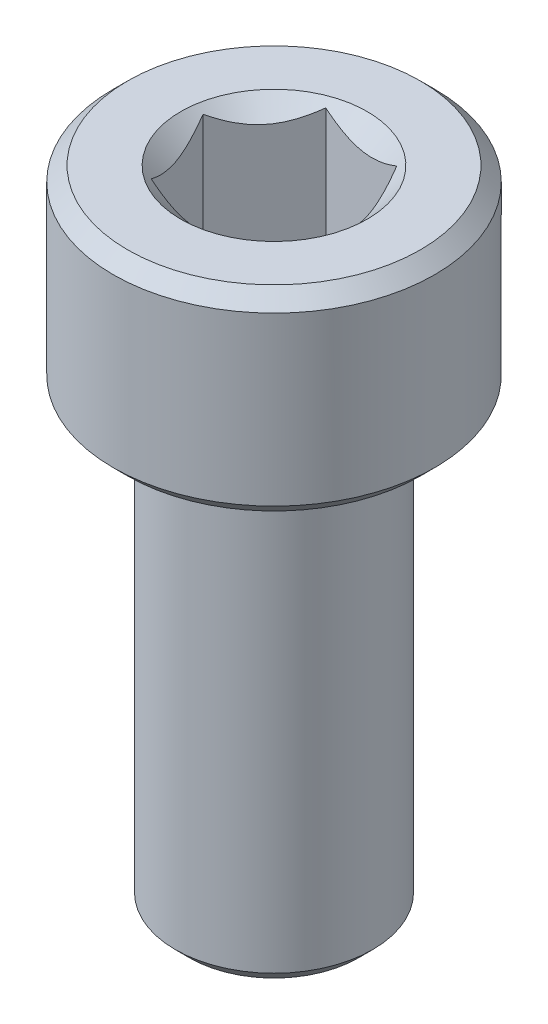
ISO-10303-21;
HEADER;
FILE_DESCRIPTION(('STEP AP214'),'2;1');
FILE_NAME('part.step','',(''),(''),'','','');
FILE_SCHEMA(('AUTOMOTIVE_DESIGN { 1 0 10303 214 1 1 1 1 }'));
ENDSEC;
DATA;
#1=APPLICATION_CONTEXT('core data for automotive mechanical design processes');
#2=APPLICATION_PROTOCOL_DEFINITION('international standard','automotive_design',2000,#1);
#3=PRODUCT_CONTEXT('',#1,'mechanical');
#4=PRODUCT('Part','Part','',(#3));
#5=PRODUCT_RELATED_PRODUCT_CATEGORY('part','',(#4));
#6=PRODUCT_DEFINITION_FORMATION('','',#4);
#7=PRODUCT_DEFINITION_CONTEXT('part definition',#1,'design');
#8=PRODUCT_DEFINITION('design','',#6,#7);
#9=PRODUCT_DEFINITION_SHAPE('','',#8);
#10=(LENGTH_UNIT() NAMED_UNIT(*) SI_UNIT(.MILLI.,.METRE.));
#11=(NAMED_UNIT(*) PLANE_ANGLE_UNIT() SI_UNIT($,.RADIAN.));
#12=(NAMED_UNIT(*) SI_UNIT($,.STERADIAN.) SOLID_ANGLE_UNIT());
#13=UNCERTAINTY_MEASURE_WITH_UNIT(LENGTH_MEASURE(1.E-05),#10,'distance_accuracy_value','');
#14=(GEOMETRIC_REPRESENTATION_CONTEXT(3) GLOBAL_UNCERTAINTY_ASSIGNED_CONTEXT((#13)) GLOBAL_UNIT_ASSIGNED_CONTEXT((#10,
#11,#12)) REPRESENTATION_CONTEXT('',''));
#15=CARTESIAN_POINT('',(0.,0.,0.));
#16=DIRECTION('',(0.,0.,1.));
#17=DIRECTION('',(1.,0.,0.));
#18=AXIS2_PLACEMENT_3D('',#15,#16,#17);
#19=CARTESIAN_POINT('',(-0.988367935483815,3.4671,1.18496081226657));
#20=DIRECTION('',(-0.170747114015538,0.,0.985314885229775));
#21=DIRECTION('',(0.985314885229775,0.,0.170747114015538));
#22=AXIS2_PLACEMENT_3D('',#19,#20,#21);
#23=PLANE('',#22);
#24=CARTESIAN_POINT('',(0.532022198169984,5.59435000000001,1.44843214654825));
#25=CARTESIAN_POINT('',(0.489893041082898,5.57299718910421,1.44113150378281));
#26=CARTESIAN_POINT('',(0.447260198669385,5.55267496213279,1.43374357641715));
#27=CARTESIAN_POINT('',(0.360727146416913,5.51464291974015,1.41874809714392));
#28=CARTESIAN_POINT('',(0.316823411230658,5.4969414150502,1.41113993432214));
#29=CARTESIAN_POINT('',(0.183722861510869,5.44897711903994,1.38807468373147));
#30=CARTESIAN_POINT('',(0.0926542408453633,5.42359455685349,1.3722932270732));
#31=CARTESIAN_POINT('',(-0.0652496055642205,5.39622882896523,1.3449297654321));
#32=CARTESIAN_POINT('',(-0.131285576429403,5.38954526130173,1.33348626486647));
#33=CARTESIAN_POINT('',(-0.263602647167514,5.38642346348592,1.3105567848574));
#34=CARTESIAN_POINT('',(-0.329883666691748,5.38998212918226,1.29907081933772));
#35=CARTESIAN_POINT('',(-0.44710441715348,5.4049627623266,1.27875740974236));
#36=CARTESIAN_POINT('',(-0.498290069621265,5.41453778015629,1.26988734945109));
#37=CARTESIAN_POINT('',(-0.599538914611206,5.43885629940858,1.2523417421142));
#38=CARTESIAN_POINT('',(-0.649599818871196,5.4536094725229,1.24366659160593));
#39=CARTESIAN_POINT('',(-0.748712926442786,5.48746849747554,1.22649109031934));
#40=CARTESIAN_POINT('',(-0.797752858505959,5.50661045824294,1.21799286604929));
#41=CARTESIAN_POINT('',(-0.894207955214743,5.54820948984585,1.201277976584));
#42=CARTESIAN_POINT('',(-0.941629227303755,5.57065187158946,1.19306025301814));
#43=CARTESIAN_POINT('',(-0.98836793548381,5.59435000000001,1.18496081226657));
#44=B_SPLINE_CURVE_WITH_KNOTS('',3,(#24,#25,#26,#27,#28,#29,#30,#31,#32,#33,#34,#35,#36,#37,#38,
#39,#40,#41,#42,#43),.UNSPECIFIED.,.F.,.F.,(4,2,2,2,2,2,2,2,2,4),(0.,0.143337612145358,
0.28712045853224,0.573034890803241,0.774383515114258,0.975671122383332,1.1338567978316,
1.292339516684,1.45217618135914,1.61132186571169),.UNSPECIFIED.);
#45=CARTESIAN_POINT('',(0.532022198169988,5.59435000000001,1.44843214654825));
#46=VERTEX_POINT('',#45);
#47=CARTESIAN_POINT('',(-0.988367935483813,5.59435000000002,1.18496081226657));
#48=VERTEX_POINT('',#47);
#49=EDGE_CURVE('E21',#46,#48,#44,.T.);
#50=ORIENTED_EDGE('',*,*,#49,.F.);
#51=DIRECTION('',(0.,1.,0.));
#52=VECTOR('',#51,1.);
#53=CARTESIAN_POINT('',(0.532022198169989,3.4671,1.44843214654825));
#54=LINE('',#53,#52);
#55=CARTESIAN_POINT('',(0.532022198169988,3.4671,1.44843214654825));
#56=VERTEX_POINT('',#55);
#57=EDGE_CURVE('E119',#46,#56,#54,.F.);
#58=ORIENTED_EDGE('',*,*,#57,.T.);
#59=DIRECTION('',(0.985314885229775,0.,0.170747114015538));
#60=VECTOR('',#59,1.);
#61=CARTESIAN_POINT('',(-0.988367935483815,3.4671,1.18496081226657));
#62=LINE('',#61,#60);
#63=CARTESIAN_POINT('',(-0.988367935483815,3.4671,1.18496081226657));
#64=VERTEX_POINT('',#63);
#65=EDGE_CURVE('E70',#64,#56,#62,.T.);
#66=ORIENTED_EDGE('',*,*,#65,.F.);
#67=DIRECTION('',(0.,1.,0.));
#68=VECTOR('',#67,1.);
#69=CARTESIAN_POINT('',(-0.988367935483815,3.4671,1.18496081226657));
#70=LINE('',#69,#68);
#71=EDGE_CURVE('E127',#64,#48,#70,.T.);
#72=ORIENTED_EDGE('',*,*,#71,.T.);
#73=EDGE_LOOP('',(#50,#58,#66,#72));
#74=FACE_BOUND('',#73,.T.);
#75=ADVANCED_FACE('F17',(#74),#23,.F.);
#76=CARTESIAN_POINT('',(-1.5203901336538,3.4671,-0.263471334281676));
#77=DIRECTION('',(-0.938681278343703,0.,0.344786104254553));
#78=DIRECTION('',(0.344786104254553,0.,0.938681278343703));
#79=AXIS2_PLACEMENT_3D('',#76,#77,#78);
#80=PLANE('',#79);
#81=CARTESIAN_POINT('',(-0.988367935483817,5.59435000000001,1.18496081226657));
#82=CARTESIAN_POINT('',(-1.00665379742504,5.5678577558261,1.13517749428827));
#83=CARTESIAN_POINT('',(-1.02524540062227,5.54292170500971,1.08456179475663));
#84=CARTESIAN_POINT('',(-1.06315558744464,5.49726486064311,0.981351189138943));
#85=CARTESIAN_POINT('',(-1.08247777436049,5.4765694622461,0.928746473082355));
#86=CARTESIAN_POINT('',(-1.12144001396706,5.441118100854,0.822671650374225));
#87=CARTESIAN_POINT('',(-1.14107014953794,5.426273056335,0.769228543113357));
#88=CARTESIAN_POINT('',(-1.18076246802838,5.4034014552768,0.661166078294517));
#89=CARTESIAN_POINT('',(-1.20082343925162,5.39535783229528,0.606550019583685));
#90=CARTESIAN_POINT('',(-1.23540034990448,5.38809997191749,0.512414269063899));
#91=CARTESIAN_POINT('',(-1.2498716667525,5.38702595601413,0.473016062376902));
#92=CARTESIAN_POINT('',(-1.27878882817659,5.38883833434812,0.39428899734533));
#93=CARTESIAN_POINT('',(-1.29323466642018,5.39172560342884,0.354960156240917));
#94=CARTESIAN_POINT('',(-1.32198687488843,5.4012936465334,0.276682176162418));
#95=CARTESIAN_POINT('',(-1.33629310282272,5.4079779480898,0.237733424574318));
#96=CARTESIAN_POINT('',(-1.3646666996486,5.42478005756205,0.160486215910536));
#97=CARTESIAN_POINT('',(-1.37873396332228,5.43489933878396,0.122188045290939));
#98=CARTESIAN_POINT('',(-1.4147460303796,5.46491755807321,0.0241450768416861));
#99=CARTESIAN_POINT('',(-1.43646421735889,5.48706949014084,-0.0349827570978526));
#100=CARTESIAN_POINT('',(-1.47905089985734,5.53696680038584,-0.150925137242471));
#101=CARTESIAN_POINT('',(-1.49992190217051,5.56469397054387,-0.207746508202284));
#102=CARTESIAN_POINT('',(-1.5203901336538,5.59435000000001,-0.263471334281672));
#103=B_SPLINE_CURVE_WITH_KNOTS('',3,(#81,#82,#83,#84,#85,#86,#87,#88,#89,#90,#91,#92,#93,#94,
#95,#96,#97,#98,#99,#100,#101,#102),.UNSPECIFIED.,.F.,.F.,(4,2,2,2,2,2,2,2,2,2,4),(0.,
0.177975101674256,0.356986718078619,0.533156235300421,0.708882376801158,0.83466105389366,
0.960467513475333,1.08639104181604,1.21236864873326,1.41234742485668,1.61168340439398),.UNSPECIFIED.);
#104=CARTESIAN_POINT('',(-1.5203901336538,5.59435000000002,-0.263471334281674));
#105=VERTEX_POINT('',#104);
#106=EDGE_CURVE('E129',#48,#105,#103,.T.);
#107=ORIENTED_EDGE('',*,*,#106,.F.);
#108=ORIENTED_EDGE('',*,*,#71,.F.);
#109=DIRECTION('',(0.344786104254553,0.,0.938681278343703));
#110=VECTOR('',#109,1.);
#111=CARTESIAN_POINT('',(-1.5203901336538,3.4671,-0.263471334281676));
#112=LINE('',#111,#110);
#113=CARTESIAN_POINT('',(-1.5203901336538,3.4671,-0.263471334281676));
#114=VERTEX_POINT('',#113);
#115=EDGE_CURVE('E116',#114,#64,#112,.T.);
#116=ORIENTED_EDGE('',*,*,#115,.F.);
#117=DIRECTION('',(0.,1.,0.));
#118=VECTOR('',#117,1.);
#119=CARTESIAN_POINT('',(-1.5203901336538,3.4671,-0.263471334281676));
#120=LINE('',#119,#118);
#121=EDGE_CURVE('E109',#114,#105,#120,.T.);
#122=ORIENTED_EDGE('',*,*,#121,.T.);
#123=EDGE_LOOP('',(#107,#108,#116,#122));
#124=FACE_BOUND('',#123,.T.);
#125=ADVANCED_FACE('F186',(#124),#80,.F.);
#126=CARTESIAN_POINT('',(0.532022198169989,3.4671,1.44843214654825));
#127=DIRECTION('',(0.767934164328165,0.,0.640528780975221));
#128=DIRECTION('',(0.640528780975221,0.,-0.767934164328165));
#129=AXIS2_PLACEMENT_3D('',#126,#127,#128);
#130=PLANE('',#129);
#131=CARTESIAN_POINT('',(1.5203901336538,5.59435000000001,0.26347133428168));
#132=CARTESIAN_POINT('',(1.48641944657053,5.5678577558261,0.304199014242022));
#133=CARTESIAN_POINT('',(1.45188076654442,5.54292170500971,0.345607664673719));
#134=CARTESIAN_POINT('',(1.38145285355071,5.49726486064311,0.430044152332958));
#135=CARTESIAN_POINT('',(1.34555692654477,5.4765694622461,0.473080015087051));
#136=CARTESIAN_POINT('',(1.27317455518088,5.441118100854,0.559859715728741));
#137=CARTESIAN_POINT('',(1.23670653442123,5.426273056335,0.603581465443289));
#138=CARTESIAN_POINT('',(1.16296785393777,5.4034014552768,0.691987254000534));
#139=CARTESIAN_POINT('',(1.12569944525123,5.39535783229528,0.736668594059863));
#140=CARTESIAN_POINT('',(1.06146394922321,5.38809997191749,0.813680952329511));
#141=CARTESIAN_POINT('',(1.03457975979273,5.38702595601414,0.845912583689617));
#142=CARTESIAN_POINT('',(0.980858702222046,5.38883833434813,0.910319112603995));
#143=CARTESIAN_POINT('',(0.954021845846016,5.39172560342884,0.942493996054109));
#144=CARTESIAN_POINT('',(0.900607230775229,5.4012936465334,1.00653312904177));
#145=CARTESIAN_POINT('',(0.874029736421392,5.4079779480898,1.03839706165925));
#146=CARTESIAN_POINT('',(0.821318489760058,5.42478005756205,1.10159292163909));
#147=CARTESIAN_POINT('',(0.795184932921856,5.43489933878396,1.13292461465203));
#148=CARTESIAN_POINT('',(0.72828326511103,5.46491755807321,1.21313346379108));
#149=CARTESIAN_POINT('',(0.687936152338284,5.48706949014084,1.26150588240906));
#150=CARTESIAN_POINT('',(0.608820447007038,5.53696680038584,1.35635822138793));
#151=CARTESIAN_POINT('',(0.570047197434563,5.56469397054387,1.40284372507348));
#152=CARTESIAN_POINT('',(0.532022198169992,5.59435000000001,1.44843214654825));
#153=B_SPLINE_CURVE_WITH_KNOTS('',3,(#131,#132,#133,#134,#135,#136,#137,#138,#139,#140,#141,
#142,#143,#144,#145,#146,#147,#148,#149,#150,#151,#152),.UNSPECIFIED.,.F.,.F.,(4,2,2,2,2,2,2,2,
2,2,4),(0.,0.177975101674256,0.356986718078619,0.533156235300421,0.708882376801158,
0.83466105389366,0.960467513475333,1.08639104181604,1.21236864873326,1.41234742485668,
1.61168340439398),.UNSPECIFIED.);
#154=CARTESIAN_POINT('',(1.5203901336538,5.59435000000001,0.263471334281676));
#155=VERTEX_POINT('',#154);
#156=EDGE_CURVE('E121',#155,#46,#153,.T.);
#157=ORIENTED_EDGE('',*,*,#156,.F.);
#158=DIRECTION('',(0.,1.,0.));
#159=VECTOR('',#158,1.);
#160=CARTESIAN_POINT('',(1.5203901336538,3.4671,0.263471334281676));
#161=LINE('',#160,#159);
#162=CARTESIAN_POINT('',(1.5203901336538,3.4671,0.263471334281676));
#163=VERTEX_POINT('',#162);
#164=EDGE_CURVE('E100',#155,#163,#161,.F.);
#165=ORIENTED_EDGE('',*,*,#164,.T.);
#166=DIRECTION('',(0.640528780975222,0.,-0.767934164328165));
#167=VECTOR('',#166,1.);
#168=CARTESIAN_POINT('',(0.532022198169988,3.4671,1.44843214654825));
#169=LINE('',#168,#167);
#170=EDGE_CURVE('E86',#56,#163,#169,.T.);
#171=ORIENTED_EDGE('',*,*,#170,.F.);
#172=ORIENTED_EDGE('',*,*,#57,.F.);
#173=EDGE_LOOP('',(#157,#165,#171,#172));
#174=FACE_BOUND('',#173,.T.);
#175=ADVANCED_FACE('F189',(#174),#130,.F.);
#176=CARTESIAN_POINT('',(2.50875806913762,3.4671,-0.921489477984898));
#177=DIRECTION('',(0.,1.,0.));
#178=DIRECTION('',(0.,0.,1.));
#179=AXIS2_PLACEMENT_3D('',#176,#177,#178);
#180=PLANE('',#179);
#181=ORIENTED_EDGE('',*,*,#115,.T.);
#182=ORIENTED_EDGE('',*,*,#65,.T.);
#183=ORIENTED_EDGE('',*,*,#170,.T.);
#184=DIRECTION('',(-0.344786104254553,0.,-0.938681278343703));
#185=VECTOR('',#184,1.);
#186=CARTESIAN_POINT('',(1.5203901336538,3.4671,0.263471334281676));
#187=LINE('',#186,#185);
#188=CARTESIAN_POINT('',(0.988367935483815,3.4671,-1.18496081226657));
#189=VERTEX_POINT('',#188);
#190=EDGE_CURVE('E79',#163,#189,#187,.T.);
#191=ORIENTED_EDGE('',*,*,#190,.T.);
#192=DIRECTION('',(-0.985314885229775,0.,-0.170747114015538));
#193=VECTOR('',#192,1.);
#194=CARTESIAN_POINT('',(0.988367935483815,3.4671,-1.18496081226657));
#195=LINE('',#194,#193);
#196=CARTESIAN_POINT('',(-0.532022198169989,3.4671,-1.44843214654825));
#197=VERTEX_POINT('',#196);
#198=EDGE_CURVE('E83',#189,#197,#195,.T.);
#199=ORIENTED_EDGE('',*,*,#198,.T.);
#200=DIRECTION('',(-0.640528780975221,0.,0.767934164328165));
#201=VECTOR('',#200,1.);
#202=CARTESIAN_POINT('',(-0.532022198169989,3.4671,-1.44843214654825));
#203=LINE('',#202,#201);
#204=EDGE_CURVE('E112',#197,#114,#203,.T.);
#205=ORIENTED_EDGE('',*,*,#204,.T.);
#206=EDGE_LOOP('',(#181,#182,#183,#191,#199,#205));
#207=FACE_BOUND('',#206,.T.);
#208=ADVANCED_FACE('F80',(#207),#180,.T.);
#209=CARTESIAN_POINT('',(-0.532022198169989,3.4671,-1.44843214654825));
#210=DIRECTION('',(-0.767934164328165,0.,-0.640528780975221));
#211=DIRECTION('',(-0.640528780975221,0.,0.767934164328165));
#212=AXIS2_PLACEMENT_3D('',#209,#210,#211);
#213=PLANE('',#212);
#214=CARTESIAN_POINT('',(-1.5203901336538,5.59435000000001,-0.26347133428168));
#215=CARTESIAN_POINT('',(-1.48641944657053,5.5678577558261,-0.304199014242022));
#216=CARTESIAN_POINT('',(-1.45188076654442,5.54292170500971,-0.345607664673719));
#217=CARTESIAN_POINT('',(-1.38145285355071,5.49726486064311,-0.430044152332958));
#218=CARTESIAN_POINT('',(-1.34555692654477,5.4765694622461,-0.473080015087051));
#219=CARTESIAN_POINT('',(-1.27317455518088,5.441118100854,-0.559859715728741));
#220=CARTESIAN_POINT('',(-1.23670653442123,5.426273056335,-0.603581465443289));
#221=CARTESIAN_POINT('',(-1.16296785393777,5.4034014552768,-0.691987254000534));
#222=CARTESIAN_POINT('',(-1.12569944525123,5.39535783229528,-0.736668594059863));
#223=CARTESIAN_POINT('',(-1.06146394922321,5.38809997191749,-0.813680952329511));
#224=CARTESIAN_POINT('',(-1.03457975979273,5.38702595601413,-0.845912583689617));
#225=CARTESIAN_POINT('',(-0.980858702222046,5.38883833434812,-0.910319112603995));
#226=CARTESIAN_POINT('',(-0.954021845846016,5.39172560342884,-0.942493996054109));
#227=CARTESIAN_POINT('',(-0.900607230775228,5.4012936465334,-1.00653312904177));
#228=CARTESIAN_POINT('',(-0.874029736421392,5.4079779480898,-1.03839706165925));
#229=CARTESIAN_POINT('',(-0.821318489760058,5.42478005756205,-1.10159292163909));
#230=CARTESIAN_POINT('',(-0.795184932921856,5.43489933878396,-1.13292461465203));
#231=CARTESIAN_POINT('',(-0.72828326511103,5.46491755807321,-1.21313346379108));
#232=CARTESIAN_POINT('',(-0.687936152338285,5.48706949014084,-1.26150588240906));
#233=CARTESIAN_POINT('',(-0.60882044700704,5.53696680038584,-1.35635822138792));
#234=CARTESIAN_POINT('',(-0.570047197434565,5.56469397054387,-1.40284372507348));
#235=CARTESIAN_POINT('',(-0.532022198169994,5.59435000000001,-1.44843214654824));
#236=B_SPLINE_CURVE_WITH_KNOTS('',3,(#214,#215,#216,#217,#218,#219,#220,#221,#222,#223,#224,
#225,#226,#227,#228,#229,#230,#231,#232,#233,#234,#235),.UNSPECIFIED.,.F.,.F.,(4,2,2,2,2,2,2,2,
2,2,4),(0.,0.177975101674255,0.356986718078619,0.533156235300421,0.708882376801157,
0.834661053893659,0.960467513475333,1.08639104181603,1.21236864873326,1.41234742485668,
1.61168340439398),.UNSPECIFIED.);
#237=CARTESIAN_POINT('',(-0.532022198169991,5.59435000000001,-1.44843214654825));
#238=VERTEX_POINT('',#237);
#239=EDGE_CURVE('E88',#105,#238,#236,.T.);
#240=ORIENTED_EDGE('',*,*,#239,.F.);
#241=ORIENTED_EDGE('',*,*,#121,.F.);
#242=ORIENTED_EDGE('',*,*,#204,.F.);
#243=DIRECTION('',(0.,1.,0.));
#244=VECTOR('',#243,1.);
#245=CARTESIAN_POINT('',(-0.532022198169989,3.4671,-1.44843214654825));
#246=LINE('',#245,#244);
#247=EDGE_CURVE('E95',#197,#238,#246,.T.);
#248=ORIENTED_EDGE('',*,*,#247,.T.);
#249=EDGE_LOOP('',(#240,#241,#242,#248));
#250=FACE_BOUND('',#249,.T.);
#251=ADVANCED_FACE('F196',(#250),#213,.F.);
#252=CARTESIAN_POINT('',(1.5203901336538,3.4671,0.263471334281676));
#253=DIRECTION('',(0.938681278343703,0.,-0.344786104254553));
#254=DIRECTION('',(-0.344786104254553,0.,-0.938681278343703));
#255=AXIS2_PLACEMENT_3D('',#252,#253,#254);
#256=PLANE('',#255);
#257=CARTESIAN_POINT('',(0.988367935483818,5.59435000000001,-1.18496081226657));
#258=CARTESIAN_POINT('',(1.00665379742504,5.5678577558261,-1.13517749428827));
#259=CARTESIAN_POINT('',(1.02524540062227,5.54292170500971,-1.08456179475663));
#260=CARTESIAN_POINT('',(1.06315558744464,5.49726486064311,-0.98135118913894));
#261=CARTESIAN_POINT('',(1.0824777743605,5.4765694622461,-0.928746473082352));
#262=CARTESIAN_POINT('',(1.12144001396707,5.441118100854,-0.822671650374223));
#263=CARTESIAN_POINT('',(1.14107014953794,5.426273056335,-0.769228543113355));
#264=CARTESIAN_POINT('',(1.18076246802839,5.4034014552768,-0.661166078294515));
#265=CARTESIAN_POINT('',(1.20082343925162,5.39535783229528,-0.606550019583684));
#266=CARTESIAN_POINT('',(1.23540034990448,5.38809997191749,-0.512414269063898));
#267=CARTESIAN_POINT('',(1.24987166675251,5.38702595601413,-0.4730160623769));
#268=CARTESIAN_POINT('',(1.27878882817659,5.38883833434812,-0.394288997345328));
#269=CARTESIAN_POINT('',(1.29323466642018,5.39172560342884,-0.354960156240915));
#270=CARTESIAN_POINT('',(1.32198687488843,5.4012936465334,-0.276682176162417));
#271=CARTESIAN_POINT('',(1.33629310282272,5.4079779480898,-0.237733424574317));
#272=CARTESIAN_POINT('',(1.3646666996486,5.42478005756205,-0.160486215910535));
#273=CARTESIAN_POINT('',(1.37873396332228,5.43489933878396,-0.122188045290938));
#274=CARTESIAN_POINT('',(1.4147460303796,5.46491755807321,-0.0241450768416855));
#275=CARTESIAN_POINT('',(1.43646421735889,5.48706949014084,0.0349827570978529));
#276=CARTESIAN_POINT('',(1.47905089985734,5.53696680038584,0.15092513724247));
#277=CARTESIAN_POINT('',(1.49992190217051,5.56469397054387,0.207746508202284));
#278=CARTESIAN_POINT('',(1.5203901336538,5.59435000000001,0.263471334281671));
#279=B_SPLINE_CURVE_WITH_KNOTS('',3,(#257,#258,#259,#260,#261,#262,#263,#264,#265,#266,#267,
#268,#269,#270,#271,#272,#273,#274,#275,#276,#277,#278),.UNSPECIFIED.,.F.,.F.,(4,2,2,2,2,2,2,2,
2,2,4),(0.,0.177975101674255,0.356986718078618,0.53315623530042,0.708882376801156,
0.834661053893658,0.960467513475331,1.08639104181603,1.21236864873326,1.41234742485668,
1.61168340439398),.UNSPECIFIED.);
#280=CARTESIAN_POINT('',(0.988367935483816,5.59435000000001,-1.18496081226657));
#281=VERTEX_POINT('',#280);
#282=EDGE_CURVE('E40',#281,#155,#279,.T.);
#283=ORIENTED_EDGE('',*,*,#282,.F.);
#284=DIRECTION('',(0.,1.,0.));
#285=VECTOR('',#284,1.);
#286=CARTESIAN_POINT('',(0.988367935483815,3.4671,-1.18496081226657));
#287=LINE('',#286,#285);
#288=EDGE_CURVE('E90',#281,#189,#287,.F.);
#289=ORIENTED_EDGE('',*,*,#288,.T.);
#290=ORIENTED_EDGE('',*,*,#190,.F.);
#291=ORIENTED_EDGE('',*,*,#164,.F.);
#292=EDGE_LOOP('',(#283,#289,#290,#291));
#293=FACE_BOUND('',#292,.T.);
#294=ADVANCED_FACE('F91',(#293),#256,.F.);
#295=CARTESIAN_POINT('',(0.988367935483815,3.4671,-1.18496081226657));
#296=DIRECTION('',(0.170747114015538,0.,-0.985314885229775));
#297=DIRECTION('',(-0.985314885229775,0.,-0.170747114015538));
#298=AXIS2_PLACEMENT_3D('',#295,#296,#297);
#299=PLANE('',#298);
#300=CARTESIAN_POINT('',(0.988367935483807,5.59435000000001,-1.18496081226658));
#301=CARTESIAN_POINT('',(0.936169586078008,5.56788797445681,-1.19400636476052));
#302=CARTESIAN_POINT('',(0.883100955821729,5.5429782824102,-1.20320272989907));
#303=CARTESIAN_POINT('',(0.774877004124437,5.49735734450454,-1.22195706691019));
#304=CARTESIAN_POINT('',(0.719710963595362,5.47667252654214,-1.23151689631417));
#305=CARTESIAN_POINT('',(0.608356482387243,5.44119434792655,-1.2508137288131));
#306=CARTESIAN_POINT('',(0.55219279065089,5.42632334461452,-1.26054644311611));
#307=CARTESIAN_POINT('',(0.438653596167497,5.40341436811877,-1.28022186878591));
#308=CARTESIAN_POINT('',(0.381281955390373,5.39535725276336,-1.2901639109045));
#309=CARTESIAN_POINT('',(0.269648056991862,5.38716732830295,-1.30950916414647));
#310=CARTESIAN_POINT('',(0.215420228150317,5.38656292716585,-1.31890640904028));
#311=CARTESIAN_POINT('',(0.107290135276257,5.39211715377099,-1.33764448107517));
#312=CARTESIAN_POINT('',(0.0533880792298612,5.39827972022178,-1.34698527217392));
#313=CARTESIAN_POINT('',(-0.0926411436653899,5.42360059140862,-1.37229095743766));
#314=CARTESIAN_POINT('',(-0.183734672962278,5.44898253675473,-1.38807673056064));
#315=CARTESIAN_POINT('',(-0.31684804153639,5.49694971502444,-1.41114420255525));
#316=CARTESIAN_POINT('',(-0.360749703630455,5.51465162458764,-1.4187520061269));
#317=CARTESIAN_POINT('',(-0.447272626262937,5.55268162132313,-1.43374573001877));
#318=CARTESIAN_POINT('',(-0.489897570611917,5.57300102438654,-1.44113228871362));
#319=CARTESIAN_POINT('',(-0.53202219816998,5.59435000000001,-1.44843214654825));
#320=B_SPLINE_CURVE_WITH_KNOTS('',3,(#300,#301,#302,#303,#304,#305,#306,#307,#308,#309,#310,
#311,#312,#313,#314,#315,#316,#317,#318,#319),.UNSPECIFIED.,.F.,.F.,(4,2,2,2,2,2,2,2,2,4),(0.,
0.177773553618219,0.356627201179562,0.533003262025737,0.708882170079772,0.873570161006529,
1.03835405929236,1.32429371127195,1.46807394211017,1.61138887760931),.UNSPECIFIED.);
#321=EDGE_CURVE('E94',#281,#238,#320,.T.);
#322=ORIENTED_EDGE('',*,*,#321,.T.);
#323=ORIENTED_EDGE('',*,*,#247,.F.);
#324=ORIENTED_EDGE('',*,*,#198,.F.);
#325=ORIENTED_EDGE('',*,*,#288,.F.);
#326=EDGE_LOOP('',(#322,#323,#324,#325));
#327=FACE_BOUND('',#326,.T.);
#328=ADVANCED_FACE('F98',(#327),#299,.F.);
#329=CARTESIAN_POINT('',(0.,5.70229999999994,0.));
#330=DIRECTION('',(0.,1.,0.));
#331=DIRECTION('',(0.,0.,1.));
#332=AXIS2_PLACEMENT_3D('',#329,#330,#331);
#333=CONICAL_SURFACE('',#332,1.65099999999996,0.785398163397622);
#334=ORIENTED_EDGE('',*,*,#156,.T.);
#335=ORIENTED_EDGE('',*,*,#49,.T.);
#336=ORIENTED_EDGE('',*,*,#106,.T.);
#337=ORIENTED_EDGE('',*,*,#239,.T.);
#338=ORIENTED_EDGE('',*,*,#321,.F.);
#339=ORIENTED_EDGE('',*,*,#282,.T.);
#340=EDGE_LOOP('',(#334,#335,#336,#337,#338,#339));
#341=FACE_BOUND('',#340,.T.);
#342=CARTESIAN_POINT('',(0.,5.70229999999994,0.));
#343=DIRECTION('',(0.,1.,0.));
#344=DIRECTION('',(0.,0.,1.));
#345=AXIS2_PLACEMENT_3D('',#342,#343,#344);
#346=CIRCLE('',#345,1.65099999999996);
#347=CARTESIAN_POINT('',(0.,5.70229999999994,1.65099999999996));
#348=VERTEX_POINT('',#347);
#349=EDGE_CURVE('E149',#348,#348,#346,.F.);
#350=ORIENTED_EDGE('',*,*,#349,.F.);
#351=EDGE_LOOP('',(#350));
#352=FACE_BOUND('',#351,.T.);
#353=ADVANCED_FACE('F163',(#341,#352),#333,.F.);
#354=CARTESIAN_POINT('',(0.,5.7023,2.8448));
#355=DIRECTION('',(0.,1.,0.));
#356=DIRECTION('',(0.,0.,1.));
#357=AXIS2_PLACEMENT_3D('',#354,#355,#356);
#358=PLANE('',#357);
#359=CARTESIAN_POINT('',(0.,5.70230000005267,0.));
#360=DIRECTION('',(0.,-1.,0.));
#361=DIRECTION('',(0.,0.,-1.));
#362=AXIS2_PLACEMENT_3D('',#359,#360,#361);
#363=CIRCLE('',#362,2.59079999995038);
#364=CARTESIAN_POINT('',(0.,5.70230000005267,-2.59079999995038));
#365=VERTEX_POINT('',#364);
#366=EDGE_CURVE('E145',#365,#365,#363,.T.);
#367=ORIENTED_EDGE('',*,*,#366,.F.);
#368=EDGE_LOOP('',(#367));
#369=FACE_BOUND('',#368,.T.);
#370=ORIENTED_EDGE('',*,*,#349,.T.);
#371=EDGE_LOOP('',(#370));
#372=FACE_BOUND('',#371,.T.);
#373=ADVANCED_FACE('F167',(#369,#372),#358,.T.);
#374=CARTESIAN_POINT('',(0.,5.448299999955,0.));
#375=DIRECTION('',(0.,-1.,0.));
#376=DIRECTION('',(0.,0.,-1.));
#377=AXIS2_PLACEMENT_3D('',#374,#375,#376);
#378=CONICAL_SURFACE('',#377,2.84480000004805,0.785398163397448);
#379=CARTESIAN_POINT('',(0.,5.4483,0.));
#380=DIRECTION('',(0.,1.,0.));
#381=DIRECTION('',(0.,0.,1.));
#382=AXIS2_PLACEMENT_3D('',#379,#380,#381);
#383=CIRCLE('',#382,2.8448);
#384=CARTESIAN_POINT('',(0.,5.4483,2.8448));
#385=VERTEX_POINT('',#384);
#386=EDGE_CURVE('E148',#385,#385,#383,.F.);
#387=ORIENTED_EDGE('',*,*,#386,.F.);
#388=EDGE_LOOP('',(#387));
#389=FACE_BOUND('',#388,.T.);
#390=ORIENTED_EDGE('',*,*,#366,.T.);
#391=EDGE_LOOP('',(#390));
#392=FACE_BOUND('',#391,.T.);
#393=ADVANCED_FACE('F232',(#389,#392),#378,.T.);
#394=CARTESIAN_POINT('',(0.,5.7023,0.));
#395=DIRECTION('',(0.,1.,0.));
#396=DIRECTION('',(0.,0.,1.));
#397=AXIS2_PLACEMENT_3D('',#394,#395,#396);
#398=CYLINDRICAL_SURFACE('',#397,2.8448);
#399=ORIENTED_EDGE('',*,*,#386,.T.);
#400=EDGE_LOOP('',(#399));
#401=FACE_BOUND('',#400,.T.);
#402=CARTESIAN_POINT('',(0.,2.48920000001362,0.));
#403=DIRECTION('',(0.,1.,0.));
#404=DIRECTION('',(0.,0.,1.));
#405=AXIS2_PLACEMENT_3D('',#402,#403,#404);
#406=CIRCLE('',#405,2.84479999999121);
#407=CARTESIAN_POINT('',(0.,2.48920000001362,2.84479999999121));
#408=VERTEX_POINT('',#407);
#409=EDGE_CURVE('E144',#408,#408,#406,.F.);
#410=ORIENTED_EDGE('',*,*,#409,.F.);
#411=EDGE_LOOP('',(#410));
#412=FACE_BOUND('',#411,.T.);
#413=ADVANCED_FACE('F229',(#401,#412),#398,.T.);
#414=CARTESIAN_POINT('',(0.,-5.7023,0.));
#415=DIRECTION('',(0.,-1.,0.));
#416=DIRECTION('',(0.,0.,-1.));
#417=AXIS2_PLACEMENT_3D('',#414,#415,#416);
#418=PLANE('',#417);
#419=CARTESIAN_POINT('',(0.,-5.70229999999583,0.));
#420=DIRECTION('',(0.,1.,0.));
#421=DIRECTION('',(0.,0.,1.));
#422=AXIS2_PLACEMENT_3D('',#419,#420,#421);
#423=CIRCLE('',#422,1.49225000001252);
#424=CARTESIAN_POINT('',(0.,-5.70229999999583,1.49225000001252));
#425=VERTEX_POINT('',#424);
#426=EDGE_CURVE('E141',#425,#425,#423,.T.);
#427=ORIENTED_EDGE('',*,*,#426,.F.);
#428=EDGE_LOOP('',(#427));
#429=FACE_BOUND('',#428,.T.);
#430=ADVANCED_FACE('F225',(#429),#418,.T.);
#431=CARTESIAN_POINT('',(0.,2.48919999989994,0.));
#432=DIRECTION('',(0.,1.,0.));
#433=DIRECTION('',(0.,0.,1.));
#434=AXIS2_PLACEMENT_3D('',#431,#432,#433);
#435=CONICAL_SURFACE('',#434,2.84479999987752,0.785398163397448);
#436=ORIENTED_EDGE('',*,*,#409,.T.);
#437=EDGE_LOOP('',(#436));
#438=FACE_BOUND('',#437,.T.);
#439=CARTESIAN_POINT('',(0.,2.23520000002964,0.));
#440=DIRECTION('',(0.,1.,0.));
#441=DIRECTION('',(0.,0.,1.));
#442=AXIS2_PLACEMENT_3D('',#439,#440,#441);
#443=CIRCLE('',#442,2.59080000000722);
#444=CARTESIAN_POINT('',(0.,2.23520000002964,2.59080000000722));
#445=VERTEX_POINT('',#444);
#446=EDGE_CURVE('E138',#445,#445,#443,.F.);
#447=ORIENTED_EDGE('',*,*,#446,.F.);
#448=EDGE_LOOP('',(#447));
#449=FACE_BOUND('',#448,.T.);
#450=ADVANCED_FACE('F221',(#438,#449),#435,.T.);
#451=CARTESIAN_POINT('',(0.,-5.44830000012553,0.));
#452=DIRECTION('',(0.,1.,0.));
#453=DIRECTION('',(0.,0.,1.));
#454=AXIS2_PLACEMENT_3D('',#451,#452,#453);
#455=CONICAL_SURFACE('',#454,1.74624999988282,0.785398163397448);
#456=CARTESIAN_POINT('',(0.,-5.4483,0.));
#457=DIRECTION('',(0.,1.,0.));
#458=DIRECTION('',(0.,0.,1.));
#459=AXIS2_PLACEMENT_3D('',#456,#457,#458);
#460=CIRCLE('',#459,1.74625);
#461=CARTESIAN_POINT('',(0.,-5.4483,1.74625));
#462=VERTEX_POINT('',#461);
#463=EDGE_CURVE('E31',#462,#462,#460,.T.);
#464=ORIENTED_EDGE('',*,*,#463,.F.);
#465=EDGE_LOOP('',(#464));
#466=FACE_BOUND('',#465,.T.);
#467=ORIENTED_EDGE('',*,*,#426,.T.);
#468=EDGE_LOOP('',(#467));
#469=FACE_BOUND('',#468,.T.);
#470=ADVANCED_FACE('F214',(#466,#469),#455,.T.);
#471=CARTESIAN_POINT('',(0.,2.2352,1.74625));
#472=DIRECTION('',(0.,-1.,0.));
#473=DIRECTION('',(0.,0.,-1.));
#474=AXIS2_PLACEMENT_3D('',#471,#472,#473);
#475=PLANE('',#474);
#476=CARTESIAN_POINT('',(0.,2.2352,0.));
#477=DIRECTION('',(0.,1.,0.));
#478=DIRECTION('',(0.,0.,1.));
#479=AXIS2_PLACEMENT_3D('',#476,#477,#478);
#480=CIRCLE('',#479,1.74625);
#481=CARTESIAN_POINT('',(0.,2.2352,1.74625));
#482=VERTEX_POINT('',#481);
#483=EDGE_CURVE('E11',#482,#482,#480,.F.);
#484=ORIENTED_EDGE('',*,*,#483,.F.);
#485=EDGE_LOOP('',(#484));
#486=FACE_BOUND('',#485,.T.);
#487=ORIENTED_EDGE('',*,*,#446,.T.);
#488=EDGE_LOOP('',(#487));
#489=FACE_BOUND('',#488,.T.);
#490=ADVANCED_FACE('F208',(#486,#489),#475,.T.);
#491=CARTESIAN_POINT('',(0.,5.7023,0.));
#492=DIRECTION('',(0.,1.,0.));
#493=DIRECTION('',(0.,0.,1.));
#494=AXIS2_PLACEMENT_3D('',#491,#492,#493);
#495=CYLINDRICAL_SURFACE('',#494,1.74625);
#496=ORIENTED_EDGE('',*,*,#483,.T.);
#497=EDGE_LOOP('',(#496));
#498=FACE_BOUND('',#497,.T.);
#499=ORIENTED_EDGE('',*,*,#463,.T.);
#500=EDGE_LOOP('',(#499));
#501=FACE_BOUND('',#500,.T.);
#502=ADVANCED_FACE('F206',(#498,#501),#495,.T.);
#503=CLOSED_SHELL('',(#75,#125,#175,#208,#251,#294,#328,#353,#373,#393,#413,#430,#450,#470,#490,#502));
#504=MANIFOLD_SOLID_BREP('B1',#503);
#505=ADVANCED_BREP_SHAPE_REPRESENTATION('',(#18,#504),#14);
#506=SHAPE_DEFINITION_REPRESENTATION(#9,#505);
ENDSEC;
END-ISO-10303-21;
